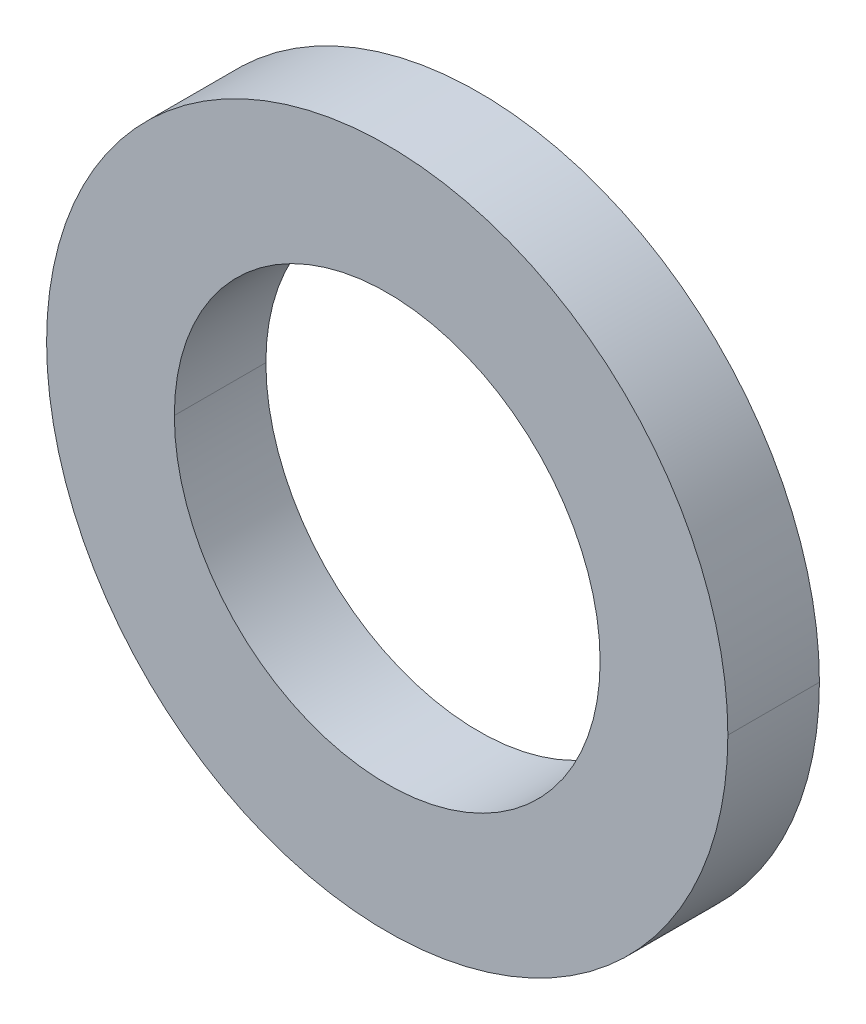
ISO-10303-21;
HEADER;
FILE_DESCRIPTION(('STEP AP214'),'2;1');
FILE_NAME('part.step','',(''),(''),'','','');
FILE_SCHEMA(('AUTOMOTIVE_DESIGN { 1 0 10303 214 1 1 1 1 }'));
ENDSEC;
DATA;
#1=APPLICATION_CONTEXT('core data for automotive mechanical design processes');
#2=APPLICATION_PROTOCOL_DEFINITION('international standard','automotive_design',2000,#1);
#3=PRODUCT_CONTEXT('',#1,'mechanical');
#4=PRODUCT('Part','Part','',(#3));
#5=PRODUCT_RELATED_PRODUCT_CATEGORY('part','',(#4));
#6=PRODUCT_DEFINITION_FORMATION('','',#4);
#7=PRODUCT_DEFINITION_CONTEXT('part definition',#1,'design');
#8=PRODUCT_DEFINITION('design','',#6,#7);
#9=PRODUCT_DEFINITION_SHAPE('','',#8);
#10=(LENGTH_UNIT() NAMED_UNIT(*) SI_UNIT(.MILLI.,.METRE.));
#11=(NAMED_UNIT(*) PLANE_ANGLE_UNIT() SI_UNIT($,.RADIAN.));
#12=(NAMED_UNIT(*) SI_UNIT($,.STERADIAN.) SOLID_ANGLE_UNIT());
#13=UNCERTAINTY_MEASURE_WITH_UNIT(LENGTH_MEASURE(1.E-05),#10,'distance_accuracy_value','');
#14=(GEOMETRIC_REPRESENTATION_CONTEXT(3) GLOBAL_UNCERTAINTY_ASSIGNED_CONTEXT((#13)) GLOBAL_UNIT_ASSIGNED_CONTEXT((#10,
#11,#12)) REPRESENTATION_CONTEXT('',''));
#15=CARTESIAN_POINT('',(0.,0.,0.));
#16=DIRECTION('',(0.,0.,1.));
#17=DIRECTION('',(1.,0.,0.));
#18=AXIS2_PLACEMENT_3D('',#15,#16,#17);
#19=CARTESIAN_POINT('',(0.,0.,4.3));
#20=DIRECTION('',(0.,0.,-1.));
#21=DIRECTION('',(-1.,0.,0.));
#22=AXIS2_PLACEMENT_3D('',#19,#20,#21);
#23=CYLINDRICAL_SURFACE('',#22,10.);
#24=DIRECTION('',(0.,0.,-1.));
#25=VECTOR('',#24,1.);
#26=CARTESIAN_POINT('',(10.,0.,4.3));
#27=LINE('',#26,#25);
#28=CARTESIAN_POINT('',(10.,0.,4.3));
#29=VERTEX_POINT('',#28);
#30=CARTESIAN_POINT('',(10.,0.,0.));
#31=VERTEX_POINT('',#30);
#32=EDGE_CURVE('E96',#29,#31,#27,.T.);
#33=ORIENTED_EDGE('',*,*,#32,.F.);
#34=CARTESIAN_POINT('',(0.,0.,4.3));
#35=DIRECTION('',(0.,0.,1.));
#36=DIRECTION('',(1.,0.,0.));
#37=AXIS2_PLACEMENT_3D('',#34,#35,#36);
#38=CIRCLE('',#37,10.);
#39=CARTESIAN_POINT('',(-10.,0.,4.3));
#40=VERTEX_POINT('',#39);
#41=EDGE_CURVE('E73',#29,#40,#38,.T.);
#42=ORIENTED_EDGE('',*,*,#41,.T.);
#43=DIRECTION('',(0.,0.,-1.));
#44=VECTOR('',#43,1.);
#45=CARTESIAN_POINT('',(-10.,0.,4.3));
#46=LINE('',#45,#44);
#47=CARTESIAN_POINT('',(-10.,0.,0.));
#48=VERTEX_POINT('',#47);
#49=EDGE_CURVE('E84',#40,#48,#46,.T.);
#50=ORIENTED_EDGE('',*,*,#49,.T.);
#51=CARTESIAN_POINT('',(0.,0.,0.));
#52=DIRECTION('',(0.,0.,1.));
#53=DIRECTION('',(1.,0.,0.));
#54=AXIS2_PLACEMENT_3D('',#51,#52,#53);
#55=CIRCLE('',#54,10.);
#56=EDGE_CURVE('E10',#31,#48,#55,.T.);
#57=ORIENTED_EDGE('',*,*,#56,.F.);
#58=EDGE_LOOP('',(#33,#42,#50,#57));
#59=FACE_BOUND('',#58,.T.);
#60=ADVANCED_FACE('F15',(#59),#23,.F.);
#61=CARTESIAN_POINT('',(0.,0.,4.3));
#62=DIRECTION('',(0.,0.,-1.));
#63=DIRECTION('',(-1.,0.,0.));
#64=AXIS2_PLACEMENT_3D('',#61,#62,#63);
#65=CYLINDRICAL_SURFACE('',#64,16.);
#66=DIRECTION('',(0.,0.,-1.));
#67=VECTOR('',#66,1.);
#68=CARTESIAN_POINT('',(16.,0.,4.3));
#69=LINE('',#68,#67);
#70=CARTESIAN_POINT('',(16.,0.,4.3));
#71=VERTEX_POINT('',#70);
#72=CARTESIAN_POINT('',(16.,0.,0.));
#73=VERTEX_POINT('',#72);
#74=EDGE_CURVE('E77',#71,#73,#69,.T.);
#75=ORIENTED_EDGE('',*,*,#74,.F.);
#76=CARTESIAN_POINT('',(0.,0.,4.3));
#77=DIRECTION('',(0.,0.,1.));
#78=DIRECTION('',(1.,0.,0.));
#79=AXIS2_PLACEMENT_3D('',#76,#77,#78);
#80=CIRCLE('',#79,16.);
#81=CARTESIAN_POINT('',(-16.,0.,4.3));
#82=VERTEX_POINT('',#81);
#83=EDGE_CURVE('E65',#82,#71,#80,.T.);
#84=ORIENTED_EDGE('',*,*,#83,.F.);
#85=DIRECTION('',(0.,0.,-1.));
#86=VECTOR('',#85,1.);
#87=CARTESIAN_POINT('',(-16.,0.,4.3));
#88=LINE('',#87,#86);
#89=CARTESIAN_POINT('',(-16.,0.,0.));
#90=VERTEX_POINT('',#89);
#91=EDGE_CURVE('E74',#82,#90,#88,.T.);
#92=ORIENTED_EDGE('',*,*,#91,.T.);
#93=CARTESIAN_POINT('',(0.,0.,0.));
#94=DIRECTION('',(0.,0.,1.));
#95=DIRECTION('',(1.,0.,0.));
#96=AXIS2_PLACEMENT_3D('',#93,#94,#95);
#97=CIRCLE('',#96,16.);
#98=EDGE_CURVE('E26',#90,#73,#97,.T.);
#99=ORIENTED_EDGE('',*,*,#98,.T.);
#100=EDGE_LOOP('',(#75,#84,#92,#99));
#101=FACE_BOUND('',#100,.T.);
#102=ADVANCED_FACE('F17',(#101),#65,.T.);
#103=CARTESIAN_POINT('',(0.,0.,0.));
#104=DIRECTION('',(0.,0.,1.));
#105=DIRECTION('',(1.,0.,0.));
#106=AXIS2_PLACEMENT_3D('',#103,#104,#105);
#107=PLANE('',#106);
#108=CARTESIAN_POINT('',(0.,0.,0.));
#109=DIRECTION('',(0.,0.,1.));
#110=DIRECTION('',(1.,0.,0.));
#111=AXIS2_PLACEMENT_3D('',#108,#109,#110);
#112=CIRCLE('',#111,10.);
#113=EDGE_CURVE('E92',#48,#31,#112,.T.);
#114=ORIENTED_EDGE('',*,*,#113,.T.);
#115=ORIENTED_EDGE('',*,*,#56,.T.);
#116=EDGE_LOOP('',(#114,#115));
#117=FACE_BOUND('',#116,.T.);
#118=ORIENTED_EDGE('',*,*,#98,.F.);
#119=CARTESIAN_POINT('',(0.,0.,0.));
#120=DIRECTION('',(0.,0.,1.));
#121=DIRECTION('',(1.,0.,0.));
#122=AXIS2_PLACEMENT_3D('',#119,#120,#121);
#123=CIRCLE('',#122,16.);
#124=EDGE_CURVE('E19',#73,#90,#123,.T.);
#125=ORIENTED_EDGE('',*,*,#124,.F.);
#126=EDGE_LOOP('',(#118,#125));
#127=FACE_BOUND('',#126,.T.);
#128=ADVANCED_FACE('F146',(#117,#127),#107,.F.);
#129=CARTESIAN_POINT('',(0.,0.,4.3));
#130=DIRECTION('',(0.,0.,1.));
#131=DIRECTION('',(1.,0.,0.));
#132=AXIS2_PLACEMENT_3D('',#129,#130,#131);
#133=PLANE('',#132);
#134=CARTESIAN_POINT('',(0.,0.,4.3));
#135=DIRECTION('',(0.,0.,1.));
#136=DIRECTION('',(1.,0.,0.));
#137=AXIS2_PLACEMENT_3D('',#134,#135,#136);
#138=CIRCLE('',#137,10.);
#139=EDGE_CURVE('E98',#40,#29,#138,.T.);
#140=ORIENTED_EDGE('',*,*,#139,.F.);
#141=ORIENTED_EDGE('',*,*,#41,.F.);
#142=EDGE_LOOP('',(#140,#141));
#143=FACE_BOUND('',#142,.T.);
#144=ORIENTED_EDGE('',*,*,#83,.T.);
#145=CARTESIAN_POINT('',(0.,0.,4.3));
#146=DIRECTION('',(0.,0.,1.));
#147=DIRECTION('',(1.,0.,0.));
#148=AXIS2_PLACEMENT_3D('',#145,#146,#147);
#149=CIRCLE('',#148,16.);
#150=EDGE_CURVE('E69',#71,#82,#149,.T.);
#151=ORIENTED_EDGE('',*,*,#150,.T.);
#152=EDGE_LOOP('',(#144,#151));
#153=FACE_BOUND('',#152,.T.);
#154=ADVANCED_FACE('F67',(#143,#153),#133,.T.);
#155=CARTESIAN_POINT('',(0.,0.,4.3));
#156=DIRECTION('',(0.,0.,-1.));
#157=DIRECTION('',(-1.,0.,0.));
#158=AXIS2_PLACEMENT_3D('',#155,#156,#157);
#159=CYLINDRICAL_SURFACE('',#158,16.);
#160=ORIENTED_EDGE('',*,*,#150,.F.);
#161=ORIENTED_EDGE('',*,*,#74,.T.);
#162=ORIENTED_EDGE('',*,*,#124,.T.);
#163=ORIENTED_EDGE('',*,*,#91,.F.);
#164=EDGE_LOOP('',(#160,#161,#162,#163));
#165=FACE_BOUND('',#164,.T.);
#166=ADVANCED_FACE('F82',(#165),#159,.T.);
#167=CARTESIAN_POINT('',(0.,0.,4.3));
#168=DIRECTION('',(0.,0.,-1.));
#169=DIRECTION('',(-1.,0.,0.));
#170=AXIS2_PLACEMENT_3D('',#167,#168,#169);
#171=CYLINDRICAL_SURFACE('',#170,10.);
#172=ORIENTED_EDGE('',*,*,#139,.T.);
#173=ORIENTED_EDGE('',*,*,#32,.T.);
#174=ORIENTED_EDGE('',*,*,#113,.F.);
#175=ORIENTED_EDGE('',*,*,#49,.F.);
#176=EDGE_LOOP('',(#172,#173,#174,#175));
#177=FACE_BOUND('',#176,.T.);
#178=ADVANCED_FACE('F148',(#177),#171,.F.);
#179=CLOSED_SHELL('',(#60,#102,#128,#154,#166,#178));
#180=MANIFOLD_SOLID_BREP('B1',#179);
#181=ADVANCED_BREP_SHAPE_REPRESENTATION('',(#18,#180),#14);
#182=SHAPE_DEFINITION_REPRESENTATION(#9,#181);
ENDSEC;
END-ISO-10303-21;
